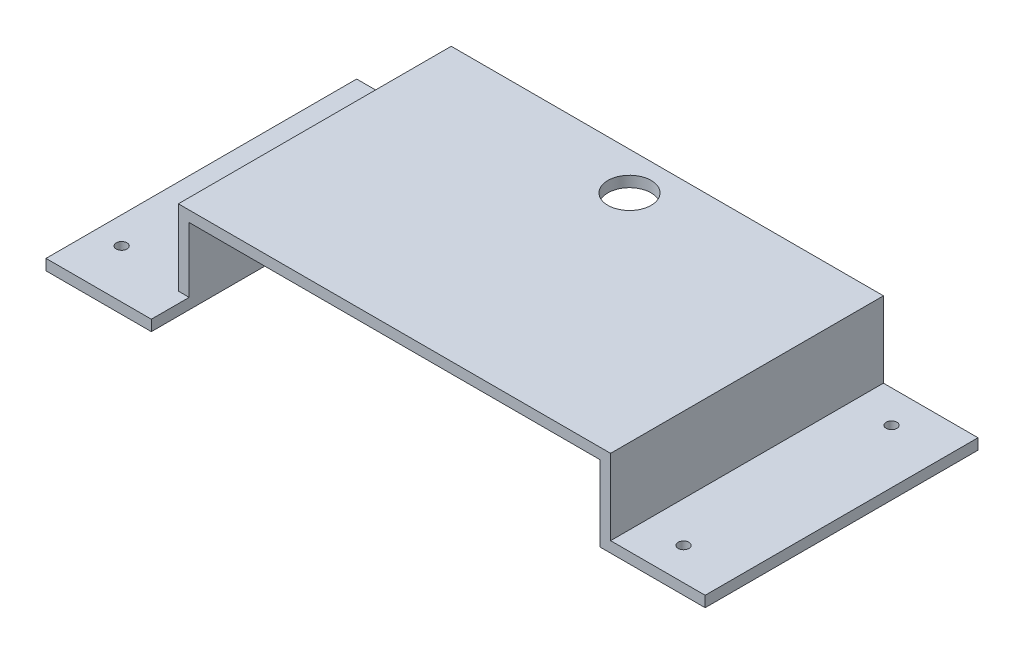
ISO-10303-21;
HEADER;
FILE_DESCRIPTION(('STEP AP214'),'2;1');
FILE_NAME('part.step','',(''),(''),'','','');
FILE_SCHEMA(('AUTOMOTIVE_DESIGN { 1 0 10303 214 1 1 1 1 }'));
ENDSEC;
DATA;
#1=APPLICATION_CONTEXT('core data for automotive mechanical design processes');
#2=APPLICATION_PROTOCOL_DEFINITION('international standard','automotive_design',2000,#1);
#3=PRODUCT_CONTEXT('',#1,'mechanical');
#4=PRODUCT('Part','Part','',(#3));
#5=PRODUCT_RELATED_PRODUCT_CATEGORY('part','',(#4));
#6=PRODUCT_DEFINITION_FORMATION('','',#4);
#7=PRODUCT_DEFINITION_CONTEXT('part definition',#1,'design');
#8=PRODUCT_DEFINITION('design','',#6,#7);
#9=PRODUCT_DEFINITION_SHAPE('','',#8);
#10=(LENGTH_UNIT() NAMED_UNIT(*) SI_UNIT(.MILLI.,.METRE.));
#11=(NAMED_UNIT(*) PLANE_ANGLE_UNIT() SI_UNIT($,.RADIAN.));
#12=(NAMED_UNIT(*) SI_UNIT($,.STERADIAN.) SOLID_ANGLE_UNIT());
#13=UNCERTAINTY_MEASURE_WITH_UNIT(LENGTH_MEASURE(1.E-05),#10,'distance_accuracy_value','');
#14=(GEOMETRIC_REPRESENTATION_CONTEXT(3) GLOBAL_UNCERTAINTY_ASSIGNED_CONTEXT((#13)) GLOBAL_UNIT_ASSIGNED_CONTEXT((#10,
#11,#12)) REPRESENTATION_CONTEXT('',''));
#15=CARTESIAN_POINT('',(0.,0.,0.));
#16=DIRECTION('',(0.,0.,1.));
#17=DIRECTION('',(1.,0.,0.));
#18=AXIS2_PLACEMENT_3D('',#15,#16,#17);
#19=CARTESIAN_POINT('',(0.,0.,-57.5));
#20=DIRECTION('',(0.,0.,-1.));
#21=DIRECTION('',(1.,0.,0.));
#22=AXIS2_PLACEMENT_3D('',#19,#20,#21);
#23=PLANE('',#22);
#24=DIRECTION('',(1.,0.,0.));
#25=VECTOR('',#24,1.);
#26=CARTESIAN_POINT('',(-30.,9.99999999999999,-57.5));
#27=LINE('',#26,#25);
#28=CARTESIAN_POINT('',(-30.,9.99999999999999,-57.5));
#29=VERTEX_POINT('',#28);
#30=CARTESIAN_POINT('',(-28.,9.99999999999999,-57.5));
#31=VERTEX_POINT('',#30);
#32=EDGE_CURVE('E11',#29,#31,#27,.T.);
#33=ORIENTED_EDGE('',*,*,#32,.T.);
#34=DIRECTION('',(0.,1.,0.));
#35=VECTOR('',#34,1.);
#36=CARTESIAN_POINT('',(-28.,0.,-57.5));
#37=LINE('',#36,#35);
#38=CARTESIAN_POINT('',(-28.,22.,-57.5));
#39=VERTEX_POINT('',#38);
#40=EDGE_CURVE('E174',#31,#39,#37,.T.);
#41=ORIENTED_EDGE('',*,*,#40,.T.);
#42=DIRECTION('',(-1.,0.,0.));
#43=VECTOR('',#42,1.);
#44=CARTESIAN_POINT('',(0.,22.,-57.5));
#45=LINE('',#44,#43);
#46=CARTESIAN_POINT('',(48.,22.,-57.5));
#47=VERTEX_POINT('',#46);
#48=EDGE_CURVE('E259',#47,#39,#45,.T.);
#49=ORIENTED_EDGE('',*,*,#48,.F.);
#50=DIRECTION('',(0.,-1.,0.));
#51=VECTOR('',#50,1.);
#52=CARTESIAN_POINT('',(48.,0.,-57.5));
#53=LINE('',#52,#51);
#54=CARTESIAN_POINT('',(48.,8.,-57.5));
#55=VERTEX_POINT('',#54);
#56=EDGE_CURVE('E199',#47,#55,#53,.T.);
#57=ORIENTED_EDGE('',*,*,#56,.T.);
#58=DIRECTION('',(1.,0.,0.));
#59=VECTOR('',#58,1.);
#60=CARTESIAN_POINT('',(0.,8.,-57.5));
#61=LINE('',#60,#59);
#62=CARTESIAN_POINT('',(67.5,8.,-57.5));
#63=VERTEX_POINT('',#62);
#64=EDGE_CURVE('E203',#55,#63,#61,.T.);
#65=ORIENTED_EDGE('',*,*,#64,.T.);
#66=DIRECTION('',(0.,1.,0.));
#67=VECTOR('',#66,1.);
#68=CARTESIAN_POINT('',(67.5,0.,-57.5));
#69=LINE('',#68,#67);
#70=CARTESIAN_POINT('',(67.5,10.,-57.5));
#71=VERTEX_POINT('',#70);
#72=EDGE_CURVE('E207',#63,#71,#69,.T.);
#73=ORIENTED_EDGE('',*,*,#72,.T.);
#74=DIRECTION('',(-1.,0.,0.));
#75=VECTOR('',#74,1.);
#76=CARTESIAN_POINT('',(0.,10.,-57.5));
#77=LINE('',#76,#75);
#78=CARTESIAN_POINT('',(50.,10.,-57.5));
#79=VERTEX_POINT('',#78);
#80=EDGE_CURVE('E190',#71,#79,#77,.T.);
#81=ORIENTED_EDGE('',*,*,#80,.T.);
#82=DIRECTION('',(0.,1.,0.));
#83=VECTOR('',#82,1.);
#84=CARTESIAN_POINT('',(50.,0.,-57.5));
#85=LINE('',#84,#83);
#86=CARTESIAN_POINT('',(50.,24.,-57.5));
#87=VERTEX_POINT('',#86);
#88=EDGE_CURVE('E194',#79,#87,#85,.T.);
#89=ORIENTED_EDGE('',*,*,#88,.T.);
#90=DIRECTION('',(-1.,0.,0.));
#91=VECTOR('',#90,1.);
#92=CARTESIAN_POINT('',(0.,24.,-57.5));
#93=LINE('',#92,#91);
#94=CARTESIAN_POINT('',(-30.,24.,-57.5));
#95=VERTEX_POINT('',#94);
#96=EDGE_CURVE('E249',#87,#95,#93,.T.);
#97=ORIENTED_EDGE('',*,*,#96,.T.);
#98=DIRECTION('',(0.,-1.,0.));
#99=VECTOR('',#98,1.);
#100=CARTESIAN_POINT('',(-30.,0.,-57.5));
#101=LINE('',#100,#99);
#102=EDGE_CURVE('E253',#95,#29,#101,.T.);
#103=ORIENTED_EDGE('',*,*,#102,.T.);
#104=EDGE_LOOP('',(#33,#41,#49,#57,#65,#73,#81,#89,#97,#103));
#105=FACE_BOUND('',#104,.T.);
#106=ADVANCED_FACE('F47',(#105),#23,.F.);
#107=CARTESIAN_POINT('',(0.,24.,-101.));
#108=DIRECTION('',(0.,1.,0.));
#109=DIRECTION('',(0.,0.,-1.));
#110=AXIS2_PLACEMENT_3D('',#107,#108,#109);
#111=PLANE('',#110);
#112=CARTESIAN_POINT('',(10.,24.,-101.));
#113=DIRECTION('',(0.,-1.,0.));
#114=DIRECTION('',(0.,0.,-1.));
#115=AXIS2_PLACEMENT_3D('',#112,#113,#114);
#116=CIRCLE('',#115,4.);
#117=CARTESIAN_POINT('',(10.,24.,-105.));
#118=VERTEX_POINT('',#117);
#119=EDGE_CURVE('E182',#118,#118,#116,.F.);
#120=ORIENTED_EDGE('',*,*,#119,.F.);
#121=EDGE_LOOP('',(#120));
#122=FACE_BOUND('',#121,.T.);
#123=DIRECTION('',(1.,0.,0.));
#124=VECTOR('',#123,1.);
#125=CARTESIAN_POINT('',(0.,24.,-108.));
#126=LINE('',#125,#124);
#127=CARTESIAN_POINT('',(-30.,24.,-108.));
#128=VERTEX_POINT('',#127);
#129=CARTESIAN_POINT('',(50.,24.,-108.));
#130=VERTEX_POINT('',#129);
#131=EDGE_CURVE('E58',#128,#130,#126,.T.);
#132=ORIENTED_EDGE('',*,*,#131,.F.);
#133=DIRECTION('',(0.,0.,-1.));
#134=VECTOR('',#133,1.);
#135=CARTESIAN_POINT('',(-30.,24.,-57.5));
#136=LINE('',#135,#134);
#137=EDGE_CURVE('E100',#95,#128,#136,.T.);
#138=ORIENTED_EDGE('',*,*,#137,.F.);
#139=ORIENTED_EDGE('',*,*,#96,.F.);
#140=DIRECTION('',(0.,0.,-1.));
#141=VECTOR('',#140,1.);
#142=CARTESIAN_POINT('',(50.,24.,-57.5));
#143=LINE('',#142,#141);
#144=EDGE_CURVE('E243',#87,#130,#143,.T.);
#145=ORIENTED_EDGE('',*,*,#144,.T.);
#146=EDGE_LOOP('',(#132,#138,#139,#145));
#147=FACE_BOUND('',#146,.T.);
#148=ADVANCED_FACE('F367',(#122,#147),#111,.T.);
#149=CARTESIAN_POINT('',(0.,22.,-101.));
#150=DIRECTION('',(0.,1.,0.));
#151=DIRECTION('',(0.,0.,-1.));
#152=AXIS2_PLACEMENT_3D('',#149,#150,#151);
#153=PLANE('',#152);
#154=DIRECTION('',(0.,0.,-1.));
#155=VECTOR('',#154,1.);
#156=CARTESIAN_POINT('',(48.,22.,-57.5));
#157=LINE('',#156,#155);
#158=CARTESIAN_POINT('',(48.,22.,-108.));
#159=VERTEX_POINT('',#158);
#160=EDGE_CURVE('E239',#47,#159,#157,.T.);
#161=ORIENTED_EDGE('',*,*,#160,.F.);
#162=ORIENTED_EDGE('',*,*,#48,.T.);
#163=DIRECTION('',(0.,0.,-1.));
#164=VECTOR('',#163,1.);
#165=CARTESIAN_POINT('',(-28.,22.,-57.5));
#166=LINE('',#165,#164);
#167=CARTESIAN_POINT('',(-28.,22.,-108.));
#168=VERTEX_POINT('',#167);
#169=EDGE_CURVE('E67',#39,#168,#166,.T.);
#170=ORIENTED_EDGE('',*,*,#169,.T.);
#171=DIRECTION('',(1.,0.,0.));
#172=VECTOR('',#171,1.);
#173=CARTESIAN_POINT('',(0.,22.,-108.));
#174=LINE('',#173,#172);
#175=EDGE_CURVE('E279',#168,#159,#174,.T.);
#176=ORIENTED_EDGE('',*,*,#175,.T.);
#177=EDGE_LOOP('',(#161,#162,#170,#176));
#178=FACE_BOUND('',#177,.T.);
#179=CARTESIAN_POINT('',(10.,22.,-101.));
#180=DIRECTION('',(0.,-1.,0.));
#181=DIRECTION('',(0.,0.,-1.));
#182=AXIS2_PLACEMENT_3D('',#179,#180,#181);
#183=CIRCLE('',#182,4.);
#184=CARTESIAN_POINT('',(10.,22.,-105.));
#185=VERTEX_POINT('',#184);
#186=EDGE_CURVE('E176',#185,#185,#183,.T.);
#187=ORIENTED_EDGE('',*,*,#186,.F.);
#188=EDGE_LOOP('',(#187));
#189=FACE_BOUND('',#188,.T.);
#190=ADVANCED_FACE('F346',(#178,#189),#153,.F.);
#191=CARTESIAN_POINT('',(0.,24.,-108.));
#192=DIRECTION('',(0.,0.,1.));
#193=DIRECTION('',(-1.,0.,0.));
#194=AXIS2_PLACEMENT_3D('',#191,#192,#193);
#195=PLANE('',#194);
#196=DIRECTION('',(0.,1.,0.));
#197=VECTOR('',#196,1.);
#198=CARTESIAN_POINT('',(-28.,0.,-108.));
#199=LINE('',#198,#197);
#200=CARTESIAN_POINT('',(-28.,8.,-108.));
#201=VERTEX_POINT('',#200);
#202=EDGE_CURVE('E93',#201,#168,#199,.T.);
#203=ORIENTED_EDGE('',*,*,#202,.F.);
#204=DIRECTION('',(1.,0.,0.));
#205=VECTOR('',#204,1.);
#206=CARTESIAN_POINT('',(0.,8.,-108.));
#207=LINE('',#206,#205);
#208=CARTESIAN_POINT('',(-47.5,8.,-108.));
#209=VERTEX_POINT('',#208);
#210=EDGE_CURVE('E272',#209,#201,#207,.T.);
#211=ORIENTED_EDGE('',*,*,#210,.F.);
#212=DIRECTION('',(0.,-1.,0.));
#213=VECTOR('',#212,1.);
#214=CARTESIAN_POINT('',(-47.5,0.,-108.));
#215=LINE('',#214,#213);
#216=CARTESIAN_POINT('',(-47.5,9.99999999999999,-108.));
#217=VERTEX_POINT('',#216);
#218=EDGE_CURVE('E268',#217,#209,#215,.T.);
#219=ORIENTED_EDGE('',*,*,#218,.F.);
#220=DIRECTION('',(-1.,0.,0.));
#221=VECTOR('',#220,1.);
#222=CARTESIAN_POINT('',(0.,10.,-108.));
#223=LINE('',#222,#221);
#224=CARTESIAN_POINT('',(-30.,9.99999999999999,-108.));
#225=VERTEX_POINT('',#224);
#226=EDGE_CURVE('E265',#225,#217,#223,.T.);
#227=ORIENTED_EDGE('',*,*,#226,.F.);
#228=DIRECTION('',(0.,-1.,0.));
#229=VECTOR('',#228,1.);
#230=CARTESIAN_POINT('',(-30.,0.,-108.));
#231=LINE('',#230,#229);
#232=EDGE_CURVE('E232',#128,#225,#231,.T.);
#233=ORIENTED_EDGE('',*,*,#232,.F.);
#234=ORIENTED_EDGE('',*,*,#131,.T.);
#235=DIRECTION('',(0.,1.,0.));
#236=VECTOR('',#235,1.);
#237=CARTESIAN_POINT('',(50.,0.,-108.));
#238=LINE('',#237,#236);
#239=CARTESIAN_POINT('',(50.,10.,-108.));
#240=VERTEX_POINT('',#239);
#241=EDGE_CURVE('E215',#240,#130,#238,.T.);
#242=ORIENTED_EDGE('',*,*,#241,.F.);
#243=DIRECTION('',(-1.,0.,0.));
#244=VECTOR('',#243,1.);
#245=CARTESIAN_POINT('',(0.,10.,-108.));
#246=LINE('',#245,#244);
#247=CARTESIAN_POINT('',(67.5,10.,-108.));
#248=VERTEX_POINT('',#247);
#249=EDGE_CURVE('E189',#248,#240,#246,.T.);
#250=ORIENTED_EDGE('',*,*,#249,.F.);
#251=DIRECTION('',(0.,1.,0.));
#252=VECTOR('',#251,1.);
#253=CARTESIAN_POINT('',(67.5,0.,-108.));
#254=LINE('',#253,#252);
#255=CARTESIAN_POINT('',(67.5,8.,-108.));
#256=VERTEX_POINT('',#255);
#257=EDGE_CURVE('E195',#256,#248,#254,.T.);
#258=ORIENTED_EDGE('',*,*,#257,.F.);
#259=DIRECTION('',(1.,0.,0.));
#260=VECTOR('',#259,1.);
#261=CARTESIAN_POINT('',(0.,8.,-108.));
#262=LINE('',#261,#260);
#263=CARTESIAN_POINT('',(48.,8.,-108.));
#264=VERTEX_POINT('',#263);
#265=EDGE_CURVE('E222',#264,#256,#262,.T.);
#266=ORIENTED_EDGE('',*,*,#265,.F.);
#267=DIRECTION('',(0.,-1.,0.));
#268=VECTOR('',#267,1.);
#269=CARTESIAN_POINT('',(48.,0.,-108.));
#270=LINE('',#269,#268);
#271=EDGE_CURVE('E218',#159,#264,#270,.T.);
#272=ORIENTED_EDGE('',*,*,#271,.F.);
#273=ORIENTED_EDGE('',*,*,#175,.F.);
#274=EDGE_LOOP('',(#203,#211,#219,#227,#233,#234,#242,#250,#258,#266,#272,#273));
#275=FACE_BOUND('',#274,.T.);
#276=ADVANCED_FACE('F49',(#275),#195,.F.);
#277=CARTESIAN_POINT('',(-28.,0.,-57.5));
#278=DIRECTION('',(1.,0.,0.));
#279=DIRECTION('',(0.,1.,0.));
#280=AXIS2_PLACEMENT_3D('',#277,#278,#279);
#281=PLANE('',#280);
#282=ORIENTED_EDGE('',*,*,#202,.T.);
#283=ORIENTED_EDGE('',*,*,#169,.F.);
#284=ORIENTED_EDGE('',*,*,#40,.F.);
#285=DIRECTION('',(0.,0.,-1.));
#286=VECTOR('',#285,1.);
#287=CARTESIAN_POINT('',(-28.,9.99999999999999,-50.5));
#288=LINE('',#287,#286);
#289=CARTESIAN_POINT('',(-28.,9.99999999999999,-50.5));
#290=VERTEX_POINT('',#289);
#291=EDGE_CURVE('E160',#290,#31,#288,.T.);
#292=ORIENTED_EDGE('',*,*,#291,.F.);
#293=DIRECTION('',(0.,-1.,0.));
#294=VECTOR('',#293,1.);
#295=CARTESIAN_POINT('',(-28.,8.,-50.5));
#296=LINE('',#295,#294);
#297=CARTESIAN_POINT('',(-28.,8.,-50.5));
#298=VERTEX_POINT('',#297);
#299=EDGE_CURVE('E165',#290,#298,#296,.T.);
#300=ORIENTED_EDGE('',*,*,#299,.T.);
#301=DIRECTION('',(0.,0.,-1.));
#302=VECTOR('',#301,1.);
#303=CARTESIAN_POINT('',(-28.,8.,-57.5));
#304=LINE('',#303,#302);
#305=EDGE_CURVE('E90',#298,#201,#304,.T.);
#306=ORIENTED_EDGE('',*,*,#305,.T.);
#307=EDGE_LOOP('',(#282,#283,#284,#292,#300,#306));
#308=FACE_BOUND('',#307,.T.);
#309=ADVANCED_FACE('F172',(#308),#281,.T.);
#310=CARTESIAN_POINT('',(0.,8.,-57.5));
#311=DIRECTION('',(0.,-1.,0.));
#312=DIRECTION('',(1.,0.,0.));
#313=AXIS2_PLACEMENT_3D('',#310,#311,#312);
#314=PLANE('',#313);
#315=CARTESIAN_POINT('',(-42.5,8.,-59.5));
#316=DIRECTION('',(0.,1.,0.));
#317=DIRECTION('',(0.,0.,1.));
#318=AXIS2_PLACEMENT_3D('',#315,#316,#317);
#319=CIRCLE('',#318,0.999999999999998);
#320=CARTESIAN_POINT('',(-42.5,8.,-58.5));
#321=VERTEX_POINT('',#320);
#322=EDGE_CURVE('E323',#321,#321,#319,.T.);
#323=ORIENTED_EDGE('',*,*,#322,.T.);
#324=EDGE_LOOP('',(#323));
#325=FACE_BOUND('',#324,.T.);
#326=CARTESIAN_POINT('',(-42.5,8.,-102.));
#327=DIRECTION('',(0.,1.,0.));
#328=DIRECTION('',(0.,0.,1.));
#329=AXIS2_PLACEMENT_3D('',#326,#327,#328);
#330=CIRCLE('',#329,0.999999999999998);
#331=CARTESIAN_POINT('',(-42.5,8.,-101.));
#332=VERTEX_POINT('',#331);
#333=EDGE_CURVE('E326',#332,#332,#330,.T.);
#334=ORIENTED_EDGE('',*,*,#333,.T.);
#335=EDGE_LOOP('',(#334));
#336=FACE_BOUND('',#335,.T.);
#337=ORIENTED_EDGE('',*,*,#210,.T.);
#338=ORIENTED_EDGE('',*,*,#305,.F.);
#339=DIRECTION('',(-1.,0.,0.));
#340=VECTOR('',#339,1.);
#341=CARTESIAN_POINT('',(-47.5,8.,-50.5));
#342=LINE('',#341,#340);
#343=CARTESIAN_POINT('',(-47.5,8.,-50.5));
#344=VERTEX_POINT('',#343);
#345=EDGE_CURVE('E169',#298,#344,#342,.T.);
#346=ORIENTED_EDGE('',*,*,#345,.T.);
#347=DIRECTION('',(0.,0.,-1.));
#348=VECTOR('',#347,1.);
#349=CARTESIAN_POINT('',(-47.5,8.,-57.5));
#350=LINE('',#349,#348);
#351=EDGE_CURVE('E282',#344,#209,#350,.T.);
#352=ORIENTED_EDGE('',*,*,#351,.T.);
#353=EDGE_LOOP('',(#337,#338,#346,#352));
#354=FACE_BOUND('',#353,.T.);
#355=ADVANCED_FACE('F339',(#325,#336,#354),#314,.T.);
#356=CARTESIAN_POINT('',(-47.5,0.,-57.5));
#357=DIRECTION('',(-1.,0.,0.));
#358=DIRECTION('',(0.,0.,-1.));
#359=AXIS2_PLACEMENT_3D('',#356,#357,#358);
#360=PLANE('',#359);
#361=ORIENTED_EDGE('',*,*,#218,.T.);
#362=ORIENTED_EDGE('',*,*,#351,.F.);
#363=DIRECTION('',(0.,1.,0.));
#364=VECTOR('',#363,1.);
#365=CARTESIAN_POINT('',(-47.5,9.99999999999999,-50.5));
#366=LINE('',#365,#364);
#367=CARTESIAN_POINT('',(-47.5,9.99999999999999,-50.5));
#368=VERTEX_POINT('',#367);
#369=EDGE_CURVE('E177',#344,#368,#366,.T.);
#370=ORIENTED_EDGE('',*,*,#369,.T.);
#371=DIRECTION('',(0.,0.,-1.));
#372=VECTOR('',#371,1.);
#373=CARTESIAN_POINT('',(-47.5,9.99999999999999,-57.5));
#374=LINE('',#373,#372);
#375=EDGE_CURVE('E161',#368,#217,#374,.T.);
#376=ORIENTED_EDGE('',*,*,#375,.T.);
#377=EDGE_LOOP('',(#361,#362,#370,#376));
#378=FACE_BOUND('',#377,.T.);
#379=ADVANCED_FACE('F355',(#378),#360,.T.);
#380=CARTESIAN_POINT('',(0.,10.,-57.5));
#381=DIRECTION('',(0.,1.,0.));
#382=DIRECTION('',(-1.,0.,0.));
#383=AXIS2_PLACEMENT_3D('',#380,#381,#382);
#384=PLANE('',#383);
#385=CARTESIAN_POINT('',(-42.5,9.99999999999999,-59.5));
#386=DIRECTION('',(0.,-1.,0.));
#387=DIRECTION('',(-1.,0.,0.));
#388=AXIS2_PLACEMENT_3D('',#385,#386,#387);
#389=CIRCLE('',#388,0.999999999999998);
#390=CARTESIAN_POINT('',(-43.5,9.99999999999999,-59.5));
#391=VERTEX_POINT('',#390);
#392=EDGE_CURVE('E51',#391,#391,#389,.T.);
#393=ORIENTED_EDGE('',*,*,#392,.T.);
#394=EDGE_LOOP('',(#393));
#395=FACE_BOUND('',#394,.T.);
#396=CARTESIAN_POINT('',(-42.5,9.99999999999999,-102.));
#397=DIRECTION('',(0.,-1.,0.));
#398=DIRECTION('',(-1.,0.,0.));
#399=AXIS2_PLACEMENT_3D('',#396,#397,#398);
#400=CIRCLE('',#399,0.999999999999998);
#401=CARTESIAN_POINT('',(-43.5,9.99999999999999,-102.));
#402=VERTEX_POINT('',#401);
#403=EDGE_CURVE('E306',#402,#402,#400,.T.);
#404=ORIENTED_EDGE('',*,*,#403,.T.);
#405=EDGE_LOOP('',(#404));
#406=FACE_BOUND('',#405,.T.);
#407=ORIENTED_EDGE('',*,*,#226,.T.);
#408=ORIENTED_EDGE('',*,*,#375,.F.);
#409=DIRECTION('',(1.,0.,0.));
#410=VECTOR('',#409,1.);
#411=CARTESIAN_POINT('',(-30.,9.99999999999999,-50.5));
#412=LINE('',#411,#410);
#413=EDGE_CURVE('E154',#368,#290,#412,.T.);
#414=ORIENTED_EDGE('',*,*,#413,.T.);
#415=ORIENTED_EDGE('',*,*,#291,.T.);
#416=ORIENTED_EDGE('',*,*,#32,.F.);
#417=DIRECTION('',(0.,0.,-1.));
#418=VECTOR('',#417,1.);
#419=CARTESIAN_POINT('',(-30.,9.99999999999999,-57.5));
#420=LINE('',#419,#418);
#421=EDGE_CURVE('E287',#29,#225,#420,.T.);
#422=ORIENTED_EDGE('',*,*,#421,.T.);
#423=EDGE_LOOP('',(#407,#408,#414,#415,#416,#422));
#424=FACE_BOUND('',#423,.T.);
#425=ADVANCED_FACE('F157',(#395,#406,#424),#384,.T.);
#426=CARTESIAN_POINT('',(-30.,0.,-57.5));
#427=DIRECTION('',(-1.,0.,0.));
#428=DIRECTION('',(0.,0.,-1.));
#429=AXIS2_PLACEMENT_3D('',#426,#427,#428);
#430=PLANE('',#429);
#431=ORIENTED_EDGE('',*,*,#421,.F.);
#432=ORIENTED_EDGE('',*,*,#102,.F.);
#433=ORIENTED_EDGE('',*,*,#137,.T.);
#434=ORIENTED_EDGE('',*,*,#232,.T.);
#435=EDGE_LOOP('',(#431,#432,#433,#434));
#436=FACE_BOUND('',#435,.T.);
#437=ADVANCED_FACE('F353',(#436),#430,.T.);
#438=CARTESIAN_POINT('',(50.,0.,-57.5));
#439=DIRECTION('',(1.,0.,0.));
#440=DIRECTION('',(0.,0.,1.));
#441=AXIS2_PLACEMENT_3D('',#438,#439,#440);
#442=PLANE('',#441);
#443=ORIENTED_EDGE('',*,*,#241,.T.);
#444=ORIENTED_EDGE('',*,*,#144,.F.);
#445=ORIENTED_EDGE('',*,*,#88,.F.);
#446=DIRECTION('',(0.,0.,-1.));
#447=VECTOR('',#446,1.);
#448=CARTESIAN_POINT('',(50.,10.,-57.5));
#449=LINE('',#448,#447);
#450=EDGE_CURVE('E211',#79,#240,#449,.T.);
#451=ORIENTED_EDGE('',*,*,#450,.T.);
#452=EDGE_LOOP('',(#443,#444,#445,#451));
#453=FACE_BOUND('',#452,.T.);
#454=ADVANCED_FACE('F396',(#453),#442,.T.);
#455=CARTESIAN_POINT('',(48.,0.,-57.5));
#456=DIRECTION('',(-1.,0.,0.));
#457=DIRECTION('',(0.,0.,-1.));
#458=AXIS2_PLACEMENT_3D('',#455,#456,#457);
#459=PLANE('',#458);
#460=ORIENTED_EDGE('',*,*,#271,.T.);
#461=DIRECTION('',(0.,0.,-1.));
#462=VECTOR('',#461,1.);
#463=CARTESIAN_POINT('',(48.,8.,-57.5));
#464=LINE('',#463,#462);
#465=EDGE_CURVE('E236',#55,#264,#464,.T.);
#466=ORIENTED_EDGE('',*,*,#465,.F.);
#467=ORIENTED_EDGE('',*,*,#56,.F.);
#468=ORIENTED_EDGE('',*,*,#160,.T.);
#469=EDGE_LOOP('',(#460,#466,#467,#468));
#470=FACE_BOUND('',#469,.T.);
#471=ADVANCED_FACE('F401',(#470),#459,.T.);
#472=CARTESIAN_POINT('',(0.,8.,-57.5));
#473=DIRECTION('',(0.,-1.,0.));
#474=DIRECTION('',(1.,0.,0.));
#475=AXIS2_PLACEMENT_3D('',#472,#473,#474);
#476=PLANE('',#475);
#477=CARTESIAN_POINT('',(57.5,8.,-63.5));
#478=DIRECTION('',(0.,1.,0.));
#479=DIRECTION('',(0.,0.,1.));
#480=AXIS2_PLACEMENT_3D('',#477,#478,#479);
#481=CIRCLE('',#480,0.999999999999998);
#482=CARTESIAN_POINT('',(57.5,8.,-62.5));
#483=VERTEX_POINT('',#482);
#484=EDGE_CURVE('E330',#483,#483,#481,.T.);
#485=ORIENTED_EDGE('',*,*,#484,.T.);
#486=EDGE_LOOP('',(#485));
#487=FACE_BOUND('',#486,.T.);
#488=CARTESIAN_POINT('',(57.5,8.,-102.));
#489=DIRECTION('',(0.,1.,0.));
#490=DIRECTION('',(0.,0.,1.));
#491=AXIS2_PLACEMENT_3D('',#488,#489,#490);
#492=CIRCLE('',#491,0.999999999999998);
#493=CARTESIAN_POINT('',(57.5,8.,-101.));
#494=VERTEX_POINT('',#493);
#495=EDGE_CURVE('E303',#494,#494,#492,.T.);
#496=ORIENTED_EDGE('',*,*,#495,.T.);
#497=EDGE_LOOP('',(#496));
#498=FACE_BOUND('',#497,.T.);
#499=ORIENTED_EDGE('',*,*,#265,.T.);
#500=DIRECTION('',(0.,0.,-1.));
#501=VECTOR('',#500,1.);
#502=CARTESIAN_POINT('',(67.5,8.,-57.5));
#503=LINE('',#502,#501);
#504=EDGE_CURVE('E233',#63,#256,#503,.T.);
#505=ORIENTED_EDGE('',*,*,#504,.F.);
#506=ORIENTED_EDGE('',*,*,#64,.F.);
#507=ORIENTED_EDGE('',*,*,#465,.T.);
#508=EDGE_LOOP('',(#499,#505,#506,#507));
#509=FACE_BOUND('',#508,.T.);
#510=ADVANCED_FACE('F407',(#487,#498,#509),#476,.T.);
#511=CARTESIAN_POINT('',(67.5,0.,-57.5));
#512=DIRECTION('',(1.,0.,0.));
#513=DIRECTION('',(0.,0.,1.));
#514=AXIS2_PLACEMENT_3D('',#511,#512,#513);
#515=PLANE('',#514);
#516=ORIENTED_EDGE('',*,*,#257,.T.);
#517=DIRECTION('',(0.,0.,-1.));
#518=VECTOR('',#517,1.);
#519=CARTESIAN_POINT('',(67.5,10.,-57.5));
#520=LINE('',#519,#518);
#521=EDGE_CURVE('E229',#71,#248,#520,.T.);
#522=ORIENTED_EDGE('',*,*,#521,.F.);
#523=ORIENTED_EDGE('',*,*,#72,.F.);
#524=ORIENTED_EDGE('',*,*,#504,.T.);
#525=EDGE_LOOP('',(#516,#522,#523,#524));
#526=FACE_BOUND('',#525,.T.);
#527=ADVANCED_FACE('F413',(#526),#515,.T.);
#528=CARTESIAN_POINT('',(0.,10.,-57.5));
#529=DIRECTION('',(0.,1.,0.));
#530=DIRECTION('',(0.,0.,-1.));
#531=AXIS2_PLACEMENT_3D('',#528,#529,#530);
#532=PLANE('',#531);
#533=CARTESIAN_POINT('',(57.5,10.,-63.5));
#534=DIRECTION('',(0.,-1.,0.));
#535=DIRECTION('',(0.,0.,-1.));
#536=AXIS2_PLACEMENT_3D('',#533,#534,#535);
#537=CIRCLE('',#536,0.999999999999998);
#538=CARTESIAN_POINT('',(57.5,10.,-64.5));
#539=VERTEX_POINT('',#538);
#540=EDGE_CURVE('E302',#539,#539,#537,.T.);
#541=ORIENTED_EDGE('',*,*,#540,.T.);
#542=EDGE_LOOP('',(#541));
#543=FACE_BOUND('',#542,.T.);
#544=CARTESIAN_POINT('',(57.5,10.,-102.));
#545=DIRECTION('',(0.,-1.,0.));
#546=DIRECTION('',(0.,0.,-1.));
#547=AXIS2_PLACEMENT_3D('',#544,#545,#546);
#548=CIRCLE('',#547,0.999999999999998);
#549=CARTESIAN_POINT('',(57.5,10.,-103.));
#550=VERTEX_POINT('',#549);
#551=EDGE_CURVE('E298',#550,#550,#548,.T.);
#552=ORIENTED_EDGE('',*,*,#551,.T.);
#553=EDGE_LOOP('',(#552));
#554=FACE_BOUND('',#553,.T.);
#555=ORIENTED_EDGE('',*,*,#249,.T.);
#556=ORIENTED_EDGE('',*,*,#450,.F.);
#557=ORIENTED_EDGE('',*,*,#80,.F.);
#558=ORIENTED_EDGE('',*,*,#521,.T.);
#559=EDGE_LOOP('',(#555,#556,#557,#558));
#560=FACE_BOUND('',#559,.T.);
#561=ADVANCED_FACE('F378',(#543,#554,#560),#532,.T.);
#562=CARTESIAN_POINT('',(10.,35.,-101.));
#563=DIRECTION('',(0.,-1.,0.));
#564=DIRECTION('',(0.,0.,1.));
#565=AXIS2_PLACEMENT_3D('',#562,#563,#564);
#566=CYLINDRICAL_SURFACE('',#565,4.);
#567=ORIENTED_EDGE('',*,*,#119,.T.);
#568=EDGE_LOOP('',(#567));
#569=FACE_BOUND('',#568,.T.);
#570=ORIENTED_EDGE('',*,*,#186,.T.);
#571=EDGE_LOOP('',(#570));
#572=FACE_BOUND('',#571,.T.);
#573=ADVANCED_FACE('F418',(#569,#572),#566,.F.);
#574=CARTESIAN_POINT('',(0.,0.,-50.5));
#575=DIRECTION('',(0.,0.,-1.));
#576=DIRECTION('',(1.,0.,0.));
#577=AXIS2_PLACEMENT_3D('',#574,#575,#576);
#578=PLANE('',#577);
#579=ORIENTED_EDGE('',*,*,#413,.F.);
#580=ORIENTED_EDGE('',*,*,#369,.F.);
#581=ORIENTED_EDGE('',*,*,#345,.F.);
#582=ORIENTED_EDGE('',*,*,#299,.F.);
#583=EDGE_LOOP('',(#579,#580,#581,#582));
#584=FACE_BOUND('',#583,.T.);
#585=ADVANCED_FACE('F167',(#584),#578,.F.);
#586=CARTESIAN_POINT('',(57.5,18.,-102.));
#587=DIRECTION('',(0.,-1.,0.));
#588=DIRECTION('',(0.,0.,1.));
#589=AXIS2_PLACEMENT_3D('',#586,#587,#588);
#590=CYLINDRICAL_SURFACE('',#589,0.999999999999998);
#591=ORIENTED_EDGE('',*,*,#551,.F.);
#592=EDGE_LOOP('',(#591));
#593=FACE_BOUND('',#592,.T.);
#594=ORIENTED_EDGE('',*,*,#495,.F.);
#595=EDGE_LOOP('',(#594));
#596=FACE_BOUND('',#595,.T.);
#597=ADVANCED_FACE('F424',(#593,#596),#590,.F.);
#598=CARTESIAN_POINT('',(57.5,18.,-63.5));
#599=DIRECTION('',(0.,-1.,0.));
#600=DIRECTION('',(0.,0.,1.));
#601=AXIS2_PLACEMENT_3D('',#598,#599,#600);
#602=CYLINDRICAL_SURFACE('',#601,0.999999999999998);
#603=ORIENTED_EDGE('',*,*,#540,.F.);
#604=EDGE_LOOP('',(#603));
#605=FACE_BOUND('',#604,.T.);
#606=ORIENTED_EDGE('',*,*,#484,.F.);
#607=EDGE_LOOP('',(#606));
#608=FACE_BOUND('',#607,.T.);
#609=ADVANCED_FACE('F426',(#605,#608),#602,.F.);
#610=CARTESIAN_POINT('',(-42.5,18.,-102.));
#611=DIRECTION('',(0.,-1.,0.));
#612=DIRECTION('',(0.,0.,1.));
#613=AXIS2_PLACEMENT_3D('',#610,#611,#612);
#614=CYLINDRICAL_SURFACE('',#613,0.999999999999998);
#615=ORIENTED_EDGE('',*,*,#403,.F.);
#616=EDGE_LOOP('',(#615));
#617=FACE_BOUND('',#616,.T.);
#618=ORIENTED_EDGE('',*,*,#333,.F.);
#619=EDGE_LOOP('',(#618));
#620=FACE_BOUND('',#619,.T.);
#621=ADVANCED_FACE('F319',(#617,#620),#614,.F.);
#622=CARTESIAN_POINT('',(-42.5,18.,-59.5));
#623=DIRECTION('',(0.,-1.,0.));
#624=DIRECTION('',(0.,0.,1.));
#625=AXIS2_PLACEMENT_3D('',#622,#623,#624);
#626=CYLINDRICAL_SURFACE('',#625,0.999999999999998);
#627=ORIENTED_EDGE('',*,*,#392,.F.);
#628=EDGE_LOOP('',(#627));
#629=FACE_BOUND('',#628,.T.);
#630=ORIENTED_EDGE('',*,*,#322,.F.);
#631=EDGE_LOOP('',(#630));
#632=FACE_BOUND('',#631,.T.);
#633=ADVANCED_FACE('F316',(#629,#632),#626,.F.);
#634=CLOSED_SHELL('',(#106,#148,#190,#276,#309,#355,#379,#425,#437,#454,#471,#510,#527,#561,
#573,#585,#597,#609,#621,#633));
#635=MANIFOLD_SOLID_BREP('B2',#634);
#636=ADVANCED_BREP_SHAPE_REPRESENTATION('',(#18,#635),#14);
#637=SHAPE_DEFINITION_REPRESENTATION(#9,#636);
ENDSEC;
END-ISO-10303-21;
